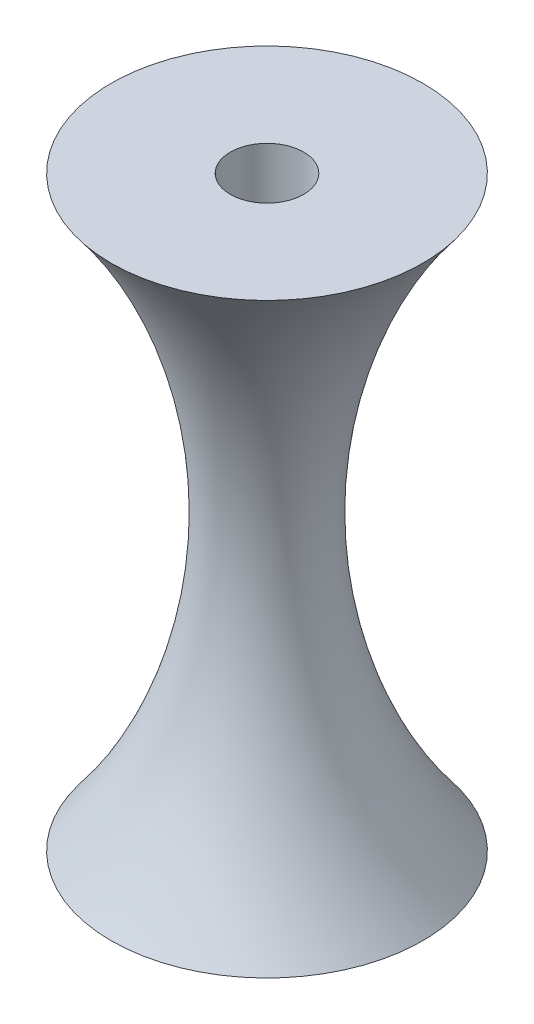
ISO-10303-21;
HEADER;
FILE_DESCRIPTION(('STEP AP214'),'2;1');
FILE_NAME('part.step','',(''),(''),'','','');
FILE_SCHEMA(('AUTOMOTIVE_DESIGN { 1 0 10303 214 1 1 1 1 }'));
ENDSEC;
DATA;
#1=APPLICATION_CONTEXT('core data for automotive mechanical design processes');
#2=APPLICATION_PROTOCOL_DEFINITION('international standard','automotive_design',2000,#1);
#3=PRODUCT_CONTEXT('',#1,'mechanical');
#4=PRODUCT('Part','Part','',(#3));
#5=PRODUCT_RELATED_PRODUCT_CATEGORY('part','',(#4));
#6=PRODUCT_DEFINITION_FORMATION('','',#4);
#7=PRODUCT_DEFINITION_CONTEXT('part definition',#1,'design');
#8=PRODUCT_DEFINITION('design','',#6,#7);
#9=PRODUCT_DEFINITION_SHAPE('','',#8);
#10=(LENGTH_UNIT() NAMED_UNIT(*) SI_UNIT(.MILLI.,.METRE.));
#11=(NAMED_UNIT(*) PLANE_ANGLE_UNIT() SI_UNIT($,.RADIAN.));
#12=(NAMED_UNIT(*) SI_UNIT($,.STERADIAN.) SOLID_ANGLE_UNIT());
#13=UNCERTAINTY_MEASURE_WITH_UNIT(LENGTH_MEASURE(1.E-05),#10,'distance_accuracy_value','');
#14=(GEOMETRIC_REPRESENTATION_CONTEXT(3) GLOBAL_UNCERTAINTY_ASSIGNED_CONTEXT((#13)) GLOBAL_UNIT_ASSIGNED_CONTEXT((#10,
#11,#12)) REPRESENTATION_CONTEXT('',''));
#15=CARTESIAN_POINT('',(0.,0.,0.));
#16=DIRECTION('',(0.,0.,1.));
#17=DIRECTION('',(1.,0.,0.));
#18=AXIS2_PLACEMENT_3D('',#15,#16,#17);
#19=CARTESIAN_POINT('',(0.,-16.,0.));
#20=DIRECTION('',(0.,1.,0.));
#21=DIRECTION('',(0.,0.,1.));
#22=AXIS2_PLACEMENT_3D('',#19,#20,#21);
#23=CYLINDRICAL_SURFACE('',#22,2.);
#24=CARTESIAN_POINT('',(0.,-16.,0.));
#25=DIRECTION('',(0.,1.,0.));
#26=DIRECTION('',(0.,0.,1.));
#27=AXIS2_PLACEMENT_3D('',#24,#25,#26);
#28=CIRCLE('',#27,2.);
#29=CARTESIAN_POINT('',(0.,-16.,2.));
#30=VERTEX_POINT('',#29);
#31=EDGE_CURVE('E75',#30,#30,#28,.T.);
#32=ORIENTED_EDGE('',*,*,#31,.F.);
#33=EDGE_LOOP('',(#32));
#34=FACE_BOUND('',#33,.T.);
#35=CARTESIAN_POINT('',(0.,-12.,0.));
#36=DIRECTION('',(0.,1.,0.));
#37=DIRECTION('',(0.,0.,1.));
#38=AXIS2_PLACEMENT_3D('',#35,#36,#37);
#39=CIRCLE('',#38,2.);
#40=CARTESIAN_POINT('',(0.,-12.,2.));
#41=VERTEX_POINT('',#40);
#42=EDGE_CURVE('E63',#41,#41,#39,.F.);
#43=ORIENTED_EDGE('',*,*,#42,.F.);
#44=EDGE_LOOP('',(#43));
#45=FACE_BOUND('',#44,.T.);
#46=ADVANCED_FACE('F42',(#34,#45),#23,.F.);
#47=CARTESIAN_POINT('',(0.,16.,0.));
#48=DIRECTION('',(0.,1.,0.));
#49=DIRECTION('',(0.,0.,1.));
#50=AXIS2_PLACEMENT_3D('',#47,#48,#49);
#51=PLANE('',#50);
#52=CARTESIAN_POINT('',(0.,16.,0.));
#53=DIRECTION('',(0.,1.,0.));
#54=DIRECTION('',(0.,0.,1.));
#55=AXIS2_PLACEMENT_3D('',#52,#53,#54);
#56=CIRCLE('',#55,2.);
#57=CARTESIAN_POINT('',(0.,16.,2.));
#58=VERTEX_POINT('',#57);
#59=EDGE_CURVE('E67',#58,#58,#56,.T.);
#60=ORIENTED_EDGE('',*,*,#59,.F.);
#61=EDGE_LOOP('',(#60));
#62=FACE_BOUND('',#61,.T.);
#63=CARTESIAN_POINT('',(0.,16.,0.));
#64=DIRECTION('',(0.,1.,0.));
#65=DIRECTION('',(0.,0.,1.));
#66=AXIS2_PLACEMENT_3D('',#63,#64,#65);
#67=CIRCLE('',#66,8.50000000000001);
#68=CARTESIAN_POINT('',(0.,16.,8.50000000000001));
#69=VERTEX_POINT('',#68);
#70=EDGE_CURVE('E55',#69,#69,#67,.T.);
#71=ORIENTED_EDGE('',*,*,#70,.T.);
#72=EDGE_LOOP('',(#71));
#73=FACE_BOUND('',#72,.T.);
#74=ADVANCED_FACE('F88',(#62,#73),#51,.T.);
#75=CARTESIAN_POINT('',(0.,0.,0.));
#76=DIRECTION('',(0.,1.,0.));
#77=DIRECTION('',(0.,0.,1.));
#78=AXIS2_PLACEMENT_3D('',#75,#76,#77);
#79=TOROIDAL_SURFACE('',#78,29.0227272727273,26.0227272727273);
#80=CARTESIAN_POINT('',(0.,-16.,0.));
#81=DIRECTION('',(0.,1.,0.));
#82=DIRECTION('',(0.,0.,1.));
#83=AXIS2_PLACEMENT_3D('',#80,#81,#82);
#84=CIRCLE('',#83,8.50000000000001);
#85=CARTESIAN_POINT('',(0.,-16.,8.50000000000001));
#86=VERTEX_POINT('',#85);
#87=EDGE_CURVE('E60',#86,#86,#84,.T.);
#88=ORIENTED_EDGE('',*,*,#87,.T.);
#89=EDGE_LOOP('',(#88));
#90=FACE_BOUND('',#89,.T.);
#91=ORIENTED_EDGE('',*,*,#70,.F.);
#92=EDGE_LOOP('',(#91));
#93=FACE_BOUND('',#92,.T.);
#94=ADVANCED_FACE('F106',(#90,#93),#79,.F.);
#95=CARTESIAN_POINT('',(0.,-16.,0.));
#96=DIRECTION('',(0.,-1.,0.));
#97=DIRECTION('',(0.,0.,-1.));
#98=AXIS2_PLACEMENT_3D('',#95,#96,#97);
#99=PLANE('',#98);
#100=ORIENTED_EDGE('',*,*,#31,.T.);
#101=EDGE_LOOP('',(#100));
#102=FACE_BOUND('',#101,.T.);
#103=ORIENTED_EDGE('',*,*,#87,.F.);
#104=EDGE_LOOP('',(#103));
#105=FACE_BOUND('',#104,.T.);
#106=ADVANCED_FACE('F83',(#102,#105),#99,.T.);
#107=CARTESIAN_POINT('',(0.,12.,0.));
#108=DIRECTION('',(0.,1.,0.));
#109=DIRECTION('',(0.,0.,1.));
#110=AXIS2_PLACEMENT_3D('',#107,#108,#109);
#111=CIRCLE('',#110,2.);
#112=CARTESIAN_POINT('',(0.,12.,2.));
#113=VERTEX_POINT('',#112);
#114=EDGE_CURVE('E68',#113,#113,#111,.F.);
#115=ORIENTED_EDGE('',*,*,#114,.T.);
#116=EDGE_LOOP('',(#115));
#117=FACE_BOUND('',#116,.T.);
#118=ORIENTED_EDGE('',*,*,#59,.T.);
#119=EDGE_LOOP('',(#118));
#120=FACE_BOUND('',#119,.T.);
#121=ADVANCED_FACE('F90',(#117,#120),#23,.F.);
#122=CARTESIAN_POINT('',(0.,-12.,0.));
#123=DIRECTION('',(0.,1.,0.));
#124=DIRECTION('',(0.,0.,1.));
#125=AXIS2_PLACEMENT_3D('',#122,#123,#124);
#126=CYLINDRICAL_SURFACE('',#125,2.5);
#127=CARTESIAN_POINT('',(0.,-11.5,0.));
#128=DIRECTION('',(0.,1.,0.));
#129=DIRECTION('',(0.,0.,1.));
#130=AXIS2_PLACEMENT_3D('',#127,#128,#129);
#131=CIRCLE('',#130,2.5);
#132=CARTESIAN_POINT('',(0.,-11.5,2.5));
#133=VERTEX_POINT('',#132);
#134=EDGE_CURVE('E10',#133,#133,#131,.F.);
#135=ORIENTED_EDGE('',*,*,#134,.T.);
#136=EDGE_LOOP('',(#135));
#137=FACE_BOUND('',#136,.T.);
#138=CARTESIAN_POINT('',(0.,11.5,0.));
#139=DIRECTION('',(0.,1.,0.));
#140=DIRECTION('',(0.,0.,1.));
#141=AXIS2_PLACEMENT_3D('',#138,#139,#140);
#142=CIRCLE('',#141,2.5);
#143=CARTESIAN_POINT('',(0.,11.5,2.5));
#144=VERTEX_POINT('',#143);
#145=EDGE_CURVE('E50',#144,#144,#142,.T.);
#146=ORIENTED_EDGE('',*,*,#145,.T.);
#147=EDGE_LOOP('',(#146));
#148=FACE_BOUND('',#147,.T.);
#149=ADVANCED_FACE('F95',(#137,#148),#126,.F.);
#150=CARTESIAN_POINT('',(0.,-11.5,0.));
#151=DIRECTION('',(0.,1.,0.));
#152=DIRECTION('',(0.,0.,1.));
#153=AXIS2_PLACEMENT_3D('',#150,#151,#152);
#154=TOROIDAL_SURFACE('',#153,2.,0.5);
#155=ORIENTED_EDGE('',*,*,#134,.F.);
#156=EDGE_LOOP('',(#155));
#157=FACE_BOUND('',#156,.T.);
#158=ORIENTED_EDGE('',*,*,#42,.T.);
#159=EDGE_LOOP('',(#158));
#160=FACE_BOUND('',#159,.T.);
#161=ADVANCED_FACE('F93',(#157,#160),#154,.F.);
#162=CARTESIAN_POINT('',(0.,11.5,0.));
#163=DIRECTION('',(0.,1.,0.));
#164=DIRECTION('',(0.,0.,1.));
#165=AXIS2_PLACEMENT_3D('',#162,#163,#164);
#166=TOROIDAL_SURFACE('',#165,2.,0.5);
#167=ORIENTED_EDGE('',*,*,#114,.F.);
#168=EDGE_LOOP('',(#167));
#169=FACE_BOUND('',#168,.T.);
#170=ORIENTED_EDGE('',*,*,#145,.F.);
#171=EDGE_LOOP('',(#170));
#172=FACE_BOUND('',#171,.T.);
#173=ADVANCED_FACE('F44',(#169,#172),#166,.F.);
#174=CLOSED_SHELL('',(#46,#74,#94,#106,#121,#149,#161,#173));
#175=MANIFOLD_SOLID_BREP('B2',#174);
#176=ADVANCED_BREP_SHAPE_REPRESENTATION('',(#18,#175),#14);
#177=SHAPE_DEFINITION_REPRESENTATION(#9,#176);
ENDSEC;
END-ISO-10303-21;
